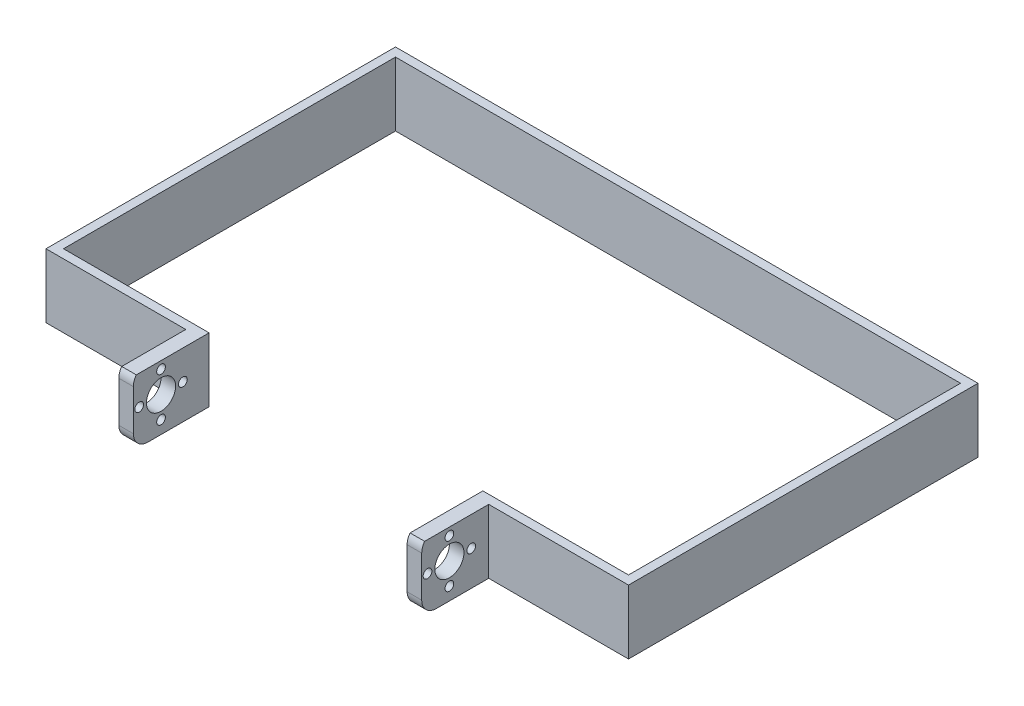
ISO-10303-21;
HEADER;
FILE_DESCRIPTION(('STEP AP214'),'2;1');
FILE_NAME('part.step','',(''),(''),'','','');
FILE_SCHEMA(('AUTOMOTIVE_DESIGN { 1 0 10303 214 1 1 1 1 }'));
ENDSEC;
DATA;
#1=APPLICATION_CONTEXT('core data for automotive mechanical design processes');
#2=APPLICATION_PROTOCOL_DEFINITION('international standard','automotive_design',2000,#1);
#3=PRODUCT_CONTEXT('',#1,'mechanical');
#4=PRODUCT('Part','Part','',(#3));
#5=PRODUCT_RELATED_PRODUCT_CATEGORY('part','',(#4));
#6=PRODUCT_DEFINITION_FORMATION('','',#4);
#7=PRODUCT_DEFINITION_CONTEXT('part definition',#1,'design');
#8=PRODUCT_DEFINITION('design','',#6,#7);
#9=PRODUCT_DEFINITION_SHAPE('','',#8);
#10=(LENGTH_UNIT() NAMED_UNIT(*) SI_UNIT(.MILLI.,.METRE.));
#11=(NAMED_UNIT(*) PLANE_ANGLE_UNIT() SI_UNIT($,.RADIAN.));
#12=(NAMED_UNIT(*) SI_UNIT($,.STERADIAN.) SOLID_ANGLE_UNIT());
#13=UNCERTAINTY_MEASURE_WITH_UNIT(LENGTH_MEASURE(1.E-05),#10,'distance_accuracy_value','');
#14=(GEOMETRIC_REPRESENTATION_CONTEXT(3) GLOBAL_UNCERTAINTY_ASSIGNED_CONTEXT((#13)) GLOBAL_UNIT_ASSIGNED_CONTEXT((#10,
#11,#12)) REPRESENTATION_CONTEXT('',''));
#15=CARTESIAN_POINT('',(0.,0.,0.));
#16=DIRECTION('',(0.,0.,1.));
#17=DIRECTION('',(1.,0.,0.));
#18=AXIS2_PLACEMENT_3D('',#15,#16,#17);
#19=CARTESIAN_POINT('',(67.,-10.8435712373607,3.));
#20=DIRECTION('',(-1.,0.,0.));
#21=DIRECTION('',(0.,0.,1.));
#22=AXIS2_PLACEMENT_3D('',#19,#20,#21);
#23=PLANE('',#22);
#24=CARTESIAN_POINT('',(67.,9.06906844399141,21.));
#25=DIRECTION('',(-1.,0.,0.));
#26=DIRECTION('',(0.,0.,1.));
#27=AXIS2_PLACEMENT_3D('',#24,#25,#26);
#28=CIRCLE('',#27,1.5);
#29=CARTESIAN_POINT('',(67.,9.06906844399141,22.5));
#30=VERTEX_POINT('',#29);
#31=EDGE_CURVE('E388',#30,#30,#28,.T.);
#32=ORIENTED_EDGE('',*,*,#31,.T.);
#33=EDGE_LOOP('',(#32));
#34=FACE_BOUND('',#33,.T.);
#35=CARTESIAN_POINT('',(67.,9.06906844399141,6.));
#36=DIRECTION('',(-1.,0.,0.));
#37=DIRECTION('',(0.,0.,1.));
#38=AXIS2_PLACEMENT_3D('',#35,#36,#37);
#39=CIRCLE('',#38,1.5);
#40=CARTESIAN_POINT('',(67.,9.06906844399141,7.5));
#41=VERTEX_POINT('',#40);
#42=EDGE_CURVE('E379',#41,#41,#39,.T.);
#43=ORIENTED_EDGE('',*,*,#42,.T.);
#44=EDGE_LOOP('',(#43));
#45=FACE_BOUND('',#44,.T.);
#46=CARTESIAN_POINT('',(67.,16.5690684439914,13.5));
#47=DIRECTION('',(-1.,0.,0.));
#48=DIRECTION('',(0.,0.,1.));
#49=AXIS2_PLACEMENT_3D('',#46,#47,#48);
#50=CIRCLE('',#49,1.5);
#51=CARTESIAN_POINT('',(67.,16.5690684439914,15.));
#52=VERTEX_POINT('',#51);
#53=EDGE_CURVE('E370',#52,#52,#50,.T.);
#54=ORIENTED_EDGE('',*,*,#53,.T.);
#55=EDGE_LOOP('',(#54));
#56=FACE_BOUND('',#55,.T.);
#57=CARTESIAN_POINT('',(67.,1.56906844399142,13.5));
#58=DIRECTION('',(-1.,0.,0.));
#59=DIRECTION('',(0.,0.,1.));
#60=AXIS2_PLACEMENT_3D('',#57,#58,#59);
#61=CIRCLE('',#60,1.5);
#62=CARTESIAN_POINT('',(67.,1.56906844399142,15.));
#63=VERTEX_POINT('',#62);
#64=EDGE_CURVE('E361',#63,#63,#61,.T.);
#65=ORIENTED_EDGE('',*,*,#64,.T.);
#66=EDGE_LOOP('',(#65));
#67=FACE_BOUND('',#66,.T.);
#68=CARTESIAN_POINT('',(67.,9.06906844399141,13.5));
#69=DIRECTION('',(-1.,0.,0.));
#70=DIRECTION('',(0.,0.,1.));
#71=AXIS2_PLACEMENT_3D('',#68,#69,#70);
#72=CIRCLE('',#71,5.);
#73=CARTESIAN_POINT('',(67.,9.06906844399141,18.5));
#74=VERTEX_POINT('',#73);
#75=EDGE_CURVE('E352',#74,#74,#72,.T.);
#76=ORIENTED_EDGE('',*,*,#75,.T.);
#77=EDGE_LOOP('',(#76));
#78=FACE_BOUND('',#77,.T.);
#79=DIRECTION('',(0.,1.,0.));
#80=VECTOR('',#79,1.);
#81=CARTESIAN_POINT('',(67.,-10.8435712373607,0.));
#82=LINE('',#81,#80);
#83=CARTESIAN_POINT('',(67.,-2.8435712373607,0.));
#84=VERTEX_POINT('',#83);
#85=CARTESIAN_POINT('',(67.,19.1564287626393,0.));
#86=VERTEX_POINT('',#85);
#87=EDGE_CURVE('E406',#84,#86,#82,.T.);
#88=ORIENTED_EDGE('',*,*,#87,.T.);
#89=DIRECTION('',(0.,0.,1.));
#90=VECTOR('',#89,1.);
#91=CARTESIAN_POINT('',(67.,19.1564287626393,3.));
#92=LINE('',#91,#90);
#93=CARTESIAN_POINT('',(67.,19.1564287626393,22.));
#94=VERTEX_POINT('',#93);
#95=EDGE_CURVE('E265',#86,#94,#92,.T.);
#96=ORIENTED_EDGE('',*,*,#95,.T.);
#97=CARTESIAN_POINT('',(67.,16.1564287626393,18.));
#98=DIRECTION('',(-1.,0.,0.));
#99=DIRECTION('',(0.,0.,1.));
#100=AXIS2_PLACEMENT_3D('',#97,#98,#99);
#101=CIRCLE('',#100,5.);
#102=CARTESIAN_POINT('',(67.,16.1564287626393,23.));
#103=VERTEX_POINT('',#102);
#104=EDGE_CURVE('E446',#94,#103,#101,.F.);
#105=ORIENTED_EDGE('',*,*,#104,.T.);
#106=DIRECTION('',(0.,1.,0.));
#107=VECTOR('',#106,1.);
#108=CARTESIAN_POINT('',(67.,0.,23.));
#109=LINE('',#108,#107);
#110=CARTESIAN_POINT('',(67.,2.1564287626393,23.));
#111=VERTEX_POINT('',#110);
#112=EDGE_CURVE('E396',#111,#103,#109,.T.);
#113=ORIENTED_EDGE('',*,*,#112,.F.);
#114=CARTESIAN_POINT('',(67.,2.1564287626393,18.));
#115=DIRECTION('',(-1.,0.,0.));
#116=DIRECTION('',(0.,0.,1.));
#117=AXIS2_PLACEMENT_3D('',#114,#115,#116);
#118=CIRCLE('',#117,5.);
#119=CARTESIAN_POINT('',(67.,-2.8435712373607,18.));
#120=VERTEX_POINT('',#119);
#121=EDGE_CURVE('E449',#111,#120,#118,.F.);
#122=ORIENTED_EDGE('',*,*,#121,.T.);
#123=DIRECTION('',(0.,0.,-1.));
#124=VECTOR('',#123,1.);
#125=CARTESIAN_POINT('',(67.,-2.8435712373607,3.));
#126=LINE('',#125,#124);
#127=EDGE_CURVE('E301',#120,#84,#126,.T.);
#128=ORIENTED_EDGE('',*,*,#127,.T.);
#129=EDGE_LOOP('',(#88,#96,#105,#113,#122,#128));
#130=FACE_BOUND('',#129,.T.);
#131=ADVANCED_FACE('F41',(#34,#45,#56,#67,#78,#130),#23,.F.);
#132=CARTESIAN_POINT('',(-37.,29.1564287626393,3.));
#133=DIRECTION('',(1.,0.,0.));
#134=DIRECTION('',(0.,0.,-1.));
#135=AXIS2_PLACEMENT_3D('',#132,#133,#134);
#136=PLANE('',#135);
#137=CARTESIAN_POINT('',(-37.,9.06906844399141,21.));
#138=DIRECTION('',(1.,0.,0.));
#139=DIRECTION('',(0.,0.,-1.));
#140=AXIS2_PLACEMENT_3D('',#137,#138,#139);
#141=CIRCLE('',#140,1.5);
#142=CARTESIAN_POINT('',(-37.,9.06906844399141,19.5));
#143=VERTEX_POINT('',#142);
#144=EDGE_CURVE('E336',#143,#143,#141,.T.);
#145=ORIENTED_EDGE('',*,*,#144,.T.);
#146=EDGE_LOOP('',(#145));
#147=FACE_BOUND('',#146,.T.);
#148=CARTESIAN_POINT('',(-37.,9.06906844399141,6.));
#149=DIRECTION('',(1.,0.,0.));
#150=DIRECTION('',(0.,0.,-1.));
#151=AXIS2_PLACEMENT_3D('',#148,#149,#150);
#152=CIRCLE('',#151,1.5);
#153=CARTESIAN_POINT('',(-37.,9.06906844399141,4.5));
#154=VERTEX_POINT('',#153);
#155=EDGE_CURVE('E332',#154,#154,#152,.T.);
#156=ORIENTED_EDGE('',*,*,#155,.T.);
#157=EDGE_LOOP('',(#156));
#158=FACE_BOUND('',#157,.T.);
#159=CARTESIAN_POINT('',(-37.,16.5690684439914,13.5));
#160=DIRECTION('',(1.,0.,0.));
#161=DIRECTION('',(0.,0.,-1.));
#162=AXIS2_PLACEMENT_3D('',#159,#160,#161);
#163=CIRCLE('',#162,1.5);
#164=CARTESIAN_POINT('',(-37.,16.5690684439914,12.));
#165=VERTEX_POINT('',#164);
#166=EDGE_CURVE('E328',#165,#165,#163,.T.);
#167=ORIENTED_EDGE('',*,*,#166,.T.);
#168=EDGE_LOOP('',(#167));
#169=FACE_BOUND('',#168,.T.);
#170=CARTESIAN_POINT('',(-37.,1.56906844399142,13.5));
#171=DIRECTION('',(1.,0.,0.));
#172=DIRECTION('',(0.,0.,-1.));
#173=AXIS2_PLACEMENT_3D('',#170,#171,#172);
#174=CIRCLE('',#173,1.5);
#175=CARTESIAN_POINT('',(-37.,1.56906844399142,12.));
#176=VERTEX_POINT('',#175);
#177=EDGE_CURVE('E327',#176,#176,#174,.T.);
#178=ORIENTED_EDGE('',*,*,#177,.T.);
#179=EDGE_LOOP('',(#178));
#180=FACE_BOUND('',#179,.T.);
#181=CARTESIAN_POINT('',(-37.,9.06906844399141,13.5));
#182=DIRECTION('',(1.,0.,0.));
#183=DIRECTION('',(0.,0.,-1.));
#184=AXIS2_PLACEMENT_3D('',#181,#182,#183);
#185=CIRCLE('',#184,5.);
#186=CARTESIAN_POINT('',(-37.,9.06906844399141,8.49999999999999));
#187=VERTEX_POINT('',#186);
#188=EDGE_CURVE('E340',#187,#187,#185,.T.);
#189=ORIENTED_EDGE('',*,*,#188,.T.);
#190=EDGE_LOOP('',(#189));
#191=FACE_BOUND('',#190,.T.);
#192=CARTESIAN_POINT('',(-37.,16.1564287626393,18.));
#193=DIRECTION('',(1.,0.,0.));
#194=DIRECTION('',(0.,0.,-1.));
#195=AXIS2_PLACEMENT_3D('',#192,#193,#194);
#196=CIRCLE('',#195,5.);
#197=CARTESIAN_POINT('',(-37.,16.1564287626393,23.));
#198=VERTEX_POINT('',#197);
#199=CARTESIAN_POINT('',(-37.,19.1564287626393,22.));
#200=VERTEX_POINT('',#199);
#201=EDGE_CURVE('E456',#198,#200,#196,.F.);
#202=ORIENTED_EDGE('',*,*,#201,.T.);
#203=DIRECTION('',(0.,0.,-1.));
#204=VECTOR('',#203,1.);
#205=CARTESIAN_POINT('',(-37.,19.1564287626393,3.));
#206=LINE('',#205,#204);
#207=CARTESIAN_POINT('',(-37.,19.1564287626393,0.));
#208=VERTEX_POINT('',#207);
#209=EDGE_CURVE('E57',#200,#208,#206,.T.);
#210=ORIENTED_EDGE('',*,*,#209,.T.);
#211=DIRECTION('',(0.,-1.,0.));
#212=VECTOR('',#211,1.);
#213=CARTESIAN_POINT('',(-37.,29.1564287626393,0.));
#214=LINE('',#213,#212);
#215=CARTESIAN_POINT('',(-37.,-2.8435712373607,0.));
#216=VERTEX_POINT('',#215);
#217=EDGE_CURVE('E410',#208,#216,#214,.T.);
#218=ORIENTED_EDGE('',*,*,#217,.T.);
#219=DIRECTION('',(0.,0.,1.));
#220=VECTOR('',#219,1.);
#221=CARTESIAN_POINT('',(-37.,-2.8435712373607,3.));
#222=LINE('',#221,#220);
#223=CARTESIAN_POINT('',(-37.,-2.8435712373607,18.));
#224=VERTEX_POINT('',#223);
#225=EDGE_CURVE('E297',#216,#224,#222,.T.);
#226=ORIENTED_EDGE('',*,*,#225,.T.);
#227=CARTESIAN_POINT('',(-37.,2.1564287626393,18.));
#228=DIRECTION('',(1.,0.,0.));
#229=DIRECTION('',(0.,0.,-1.));
#230=AXIS2_PLACEMENT_3D('',#227,#228,#229);
#231=CIRCLE('',#230,5.);
#232=CARTESIAN_POINT('',(-37.,2.1564287626393,23.));
#233=VERTEX_POINT('',#232);
#234=EDGE_CURVE('E460',#224,#233,#231,.F.);
#235=ORIENTED_EDGE('',*,*,#234,.T.);
#236=DIRECTION('',(0.,-1.,0.));
#237=VECTOR('',#236,1.);
#238=CARTESIAN_POINT('',(-37.,0.,23.));
#239=LINE('',#238,#237);
#240=EDGE_CURVE('E403',#198,#233,#239,.T.);
#241=ORIENTED_EDGE('',*,*,#240,.F.);
#242=EDGE_LOOP('',(#202,#210,#218,#226,#235,#241));
#243=FACE_BOUND('',#242,.T.);
#244=ADVANCED_FACE('F489',(#147,#158,#169,#180,#191,#243),#136,.F.);
#245=CARTESIAN_POINT('',(-32.,0.,23.));
#246=DIRECTION('',(1.,0.,0.));
#247=DIRECTION('',(0.,1.,0.));
#248=AXIS2_PLACEMENT_3D('',#245,#246,#247);
#249=PLANE('',#248);
#250=DIRECTION('',(0.,0.,-1.));
#251=VECTOR('',#250,1.);
#252=CARTESIAN_POINT('',(-32.,19.1564287626393,23.));
#253=LINE('',#252,#251);
#254=CARTESIAN_POINT('',(-32.,19.1564287626393,22.));
#255=VERTEX_POINT('',#254);
#256=CARTESIAN_POINT('',(-32.,19.1564287626393,-3.));
#257=VERTEX_POINT('',#256);
#258=EDGE_CURVE('E232',#255,#257,#253,.T.);
#259=ORIENTED_EDGE('',*,*,#258,.F.);
#260=CARTESIAN_POINT('',(-32.,16.1564287626393,18.));
#261=DIRECTION('',(1.,0.,0.));
#262=DIRECTION('',(0.,1.,0.));
#263=AXIS2_PLACEMENT_3D('',#260,#261,#262);
#264=CIRCLE('',#263,5.);
#265=CARTESIAN_POINT('',(-32.,16.1564287626393,23.));
#266=VERTEX_POINT('',#265);
#267=EDGE_CURVE('E469',#255,#266,#264,.T.);
#268=ORIENTED_EDGE('',*,*,#267,.T.);
#269=DIRECTION('',(0.,-1.,0.));
#270=VECTOR('',#269,1.);
#271=CARTESIAN_POINT('',(-32.,0.,23.));
#272=LINE('',#271,#270);
#273=CARTESIAN_POINT('',(-32.,2.1564287626393,23.));
#274=VERTEX_POINT('',#273);
#275=EDGE_CURVE('E400',#266,#274,#272,.T.);
#276=ORIENTED_EDGE('',*,*,#275,.T.);
#277=CARTESIAN_POINT('',(-32.,2.1564287626393,18.));
#278=DIRECTION('',(1.,0.,0.));
#279=DIRECTION('',(0.,1.,0.));
#280=AXIS2_PLACEMENT_3D('',#277,#278,#279);
#281=CIRCLE('',#280,5.);
#282=CARTESIAN_POINT('',(-32.,-2.8435712373607,18.));
#283=VERTEX_POINT('',#282);
#284=EDGE_CURVE('E472',#274,#283,#281,.T.);
#285=ORIENTED_EDGE('',*,*,#284,.T.);
#286=DIRECTION('',(0.,0.,1.));
#287=VECTOR('',#286,1.);
#288=CARTESIAN_POINT('',(-32.,-2.8435712373607,23.));
#289=LINE('',#288,#287);
#290=CARTESIAN_POINT('',(-32.,-2.84357123736069,-3.));
#291=VERTEX_POINT('',#290);
#292=EDGE_CURVE('E293',#291,#283,#289,.T.);
#293=ORIENTED_EDGE('',*,*,#292,.F.);
#294=DIRECTION('',(0.,1.,0.));
#295=VECTOR('',#294,1.);
#296=CARTESIAN_POINT('',(-32.,-70.8435712373607,-3.));
#297=LINE('',#296,#295);
#298=EDGE_CURVE('E306',#291,#257,#297,.T.);
#299=ORIENTED_EDGE('',*,*,#298,.T.);
#300=EDGE_LOOP('',(#259,#268,#276,#285,#293,#299));
#301=FACE_BOUND('',#300,.T.);
#302=CARTESIAN_POINT('',(-32.,9.06906844399141,21.));
#303=DIRECTION('',(1.,0.,0.));
#304=DIRECTION('',(0.,1.,0.));
#305=AXIS2_PLACEMENT_3D('',#302,#303,#304);
#306=CIRCLE('',#305,1.5);
#307=CARTESIAN_POINT('',(-32.,10.5690684439914,21.));
#308=VERTEX_POINT('',#307);
#309=EDGE_CURVE('E384',#308,#308,#306,.T.);
#310=ORIENTED_EDGE('',*,*,#309,.F.);
#311=EDGE_LOOP('',(#310));
#312=FACE_BOUND('',#311,.T.);
#313=CARTESIAN_POINT('',(-32.,9.06906844399141,6.));
#314=DIRECTION('',(1.,0.,0.));
#315=DIRECTION('',(0.,1.,0.));
#316=AXIS2_PLACEMENT_3D('',#313,#314,#315);
#317=CIRCLE('',#316,1.5);
#318=CARTESIAN_POINT('',(-32.,10.5690684439914,6.));
#319=VERTEX_POINT('',#318);
#320=EDGE_CURVE('E375',#319,#319,#317,.T.);
#321=ORIENTED_EDGE('',*,*,#320,.F.);
#322=EDGE_LOOP('',(#321));
#323=FACE_BOUND('',#322,.T.);
#324=CARTESIAN_POINT('',(-32.,16.5690684439914,13.5));
#325=DIRECTION('',(1.,0.,0.));
#326=DIRECTION('',(0.,1.,0.));
#327=AXIS2_PLACEMENT_3D('',#324,#325,#326);
#328=CIRCLE('',#327,1.5);
#329=CARTESIAN_POINT('',(-32.,18.0690684439914,13.5));
#330=VERTEX_POINT('',#329);
#331=EDGE_CURVE('E366',#330,#330,#328,.T.);
#332=ORIENTED_EDGE('',*,*,#331,.F.);
#333=EDGE_LOOP('',(#332));
#334=FACE_BOUND('',#333,.T.);
#335=CARTESIAN_POINT('',(-32.,1.56906844399142,13.5));
#336=DIRECTION('',(1.,0.,0.));
#337=DIRECTION('',(0.,1.,0.));
#338=AXIS2_PLACEMENT_3D('',#335,#336,#337);
#339=CIRCLE('',#338,1.5);
#340=CARTESIAN_POINT('',(-32.,3.06906844399142,13.5));
#341=VERTEX_POINT('',#340);
#342=EDGE_CURVE('E357',#341,#341,#339,.T.);
#343=ORIENTED_EDGE('',*,*,#342,.F.);
#344=EDGE_LOOP('',(#343));
#345=FACE_BOUND('',#344,.T.);
#346=CARTESIAN_POINT('',(-32.,9.06906844399141,13.5));
#347=DIRECTION('',(1.,0.,0.));
#348=DIRECTION('',(0.,1.,0.));
#349=AXIS2_PLACEMENT_3D('',#346,#347,#348);
#350=CIRCLE('',#349,5.);
#351=CARTESIAN_POINT('',(-32.,14.0690684439914,13.5));
#352=VERTEX_POINT('',#351);
#353=EDGE_CURVE('E348',#352,#352,#350,.T.);
#354=ORIENTED_EDGE('',*,*,#353,.F.);
#355=EDGE_LOOP('',(#354));
#356=FACE_BOUND('',#355,.T.);
#357=ADVANCED_FACE('F482',(#301,#312,#323,#334,#345,#356),#249,.T.);
#358=CARTESIAN_POINT('',(0.,0.,23.));
#359=DIRECTION('',(0.,0.,1.));
#360=DIRECTION('',(1.,0.,0.));
#361=AXIS2_PLACEMENT_3D('',#358,#359,#360);
#362=PLANE('',#361);
#363=ORIENTED_EDGE('',*,*,#240,.T.);
#364=DIRECTION('',(-1.,0.,0.));
#365=VECTOR('',#364,1.);
#366=CARTESIAN_POINT('',(-32.,2.1564287626393,23.));
#367=LINE('',#366,#365);
#368=EDGE_CURVE('E65',#233,#274,#367,.F.);
#369=ORIENTED_EDGE('',*,*,#368,.T.);
#370=ORIENTED_EDGE('',*,*,#275,.F.);
#371=DIRECTION('',(-1.,0.,0.));
#372=VECTOR('',#371,1.);
#373=CARTESIAN_POINT('',(-37.,16.1564287626393,23.));
#374=LINE('',#373,#372);
#375=EDGE_CURVE('E463',#266,#198,#374,.T.);
#376=ORIENTED_EDGE('',*,*,#375,.T.);
#377=EDGE_LOOP('',(#363,#369,#370,#376));
#378=FACE_BOUND('',#377,.T.);
#379=ADVANCED_FACE('F487',(#378),#362,.T.);
#380=CARTESIAN_POINT('',(62.,0.,23.));
#381=DIRECTION('',(1.,0.,0.));
#382=DIRECTION('',(0.,1.,0.));
#383=AXIS2_PLACEMENT_3D('',#380,#381,#382);
#384=PLANE('',#383);
#385=CARTESIAN_POINT('',(62.,9.06906844399141,21.));
#386=DIRECTION('',(1.,0.,0.));
#387=DIRECTION('',(0.,1.,0.));
#388=AXIS2_PLACEMENT_3D('',#385,#386,#387);
#389=CIRCLE('',#388,1.5);
#390=CARTESIAN_POINT('',(62.,10.5690684439914,21.));
#391=VERTEX_POINT('',#390);
#392=EDGE_CURVE('E383',#391,#391,#389,.T.);
#393=ORIENTED_EDGE('',*,*,#392,.T.);
#394=EDGE_LOOP('',(#393));
#395=FACE_BOUND('',#394,.T.);
#396=CARTESIAN_POINT('',(62.,9.06906844399141,6.));
#397=DIRECTION('',(1.,0.,0.));
#398=DIRECTION('',(0.,1.,0.));
#399=AXIS2_PLACEMENT_3D('',#396,#397,#398);
#400=CIRCLE('',#399,1.5);
#401=CARTESIAN_POINT('',(62.,10.5690684439914,6.));
#402=VERTEX_POINT('',#401);
#403=EDGE_CURVE('E374',#402,#402,#400,.T.);
#404=ORIENTED_EDGE('',*,*,#403,.T.);
#405=EDGE_LOOP('',(#404));
#406=FACE_BOUND('',#405,.T.);
#407=CARTESIAN_POINT('',(62.,16.5690684439914,13.5));
#408=DIRECTION('',(1.,0.,0.));
#409=DIRECTION('',(0.,1.,0.));
#410=AXIS2_PLACEMENT_3D('',#407,#408,#409);
#411=CIRCLE('',#410,1.5);
#412=CARTESIAN_POINT('',(62.,18.0690684439914,13.5));
#413=VERTEX_POINT('',#412);
#414=EDGE_CURVE('E365',#413,#413,#411,.T.);
#415=ORIENTED_EDGE('',*,*,#414,.T.);
#416=EDGE_LOOP('',(#415));
#417=FACE_BOUND('',#416,.T.);
#418=CARTESIAN_POINT('',(62.,1.56906844399142,13.5));
#419=DIRECTION('',(1.,0.,0.));
#420=DIRECTION('',(0.,1.,0.));
#421=AXIS2_PLACEMENT_3D('',#418,#419,#420);
#422=CIRCLE('',#421,1.5);
#423=CARTESIAN_POINT('',(62.,3.06906844399142,13.5));
#424=VERTEX_POINT('',#423);
#425=EDGE_CURVE('E356',#424,#424,#422,.T.);
#426=ORIENTED_EDGE('',*,*,#425,.T.);
#427=EDGE_LOOP('',(#426));
#428=FACE_BOUND('',#427,.T.);
#429=CARTESIAN_POINT('',(62.,9.06906844399141,13.5));
#430=DIRECTION('',(1.,0.,0.));
#431=DIRECTION('',(0.,1.,0.));
#432=AXIS2_PLACEMENT_3D('',#429,#430,#431);
#433=CIRCLE('',#432,5.);
#434=CARTESIAN_POINT('',(62.,14.0690684439914,13.5));
#435=VERTEX_POINT('',#434);
#436=EDGE_CURVE('E347',#435,#435,#433,.T.);
#437=ORIENTED_EDGE('',*,*,#436,.T.);
#438=EDGE_LOOP('',(#437));
#439=FACE_BOUND('',#438,.T.);
#440=CARTESIAN_POINT('',(62.,16.1564287626393,18.));
#441=DIRECTION('',(1.,0.,0.));
#442=DIRECTION('',(0.,1.,0.));
#443=AXIS2_PLACEMENT_3D('',#440,#441,#442);
#444=CIRCLE('',#443,5.);
#445=CARTESIAN_POINT('',(62.,16.1564287626393,23.));
#446=VERTEX_POINT('',#445);
#447=CARTESIAN_POINT('',(62.,19.1564287626393,22.));
#448=VERTEX_POINT('',#447);
#449=EDGE_CURVE('E432',#446,#448,#444,.F.);
#450=ORIENTED_EDGE('',*,*,#449,.T.);
#451=DIRECTION('',(0.,0.,-1.));
#452=VECTOR('',#451,1.);
#453=CARTESIAN_POINT('',(62.,19.1564287626393,23.));
#454=LINE('',#453,#452);
#455=CARTESIAN_POINT('',(62.,19.1564287626393,-3.00000000000001));
#456=VERTEX_POINT('',#455);
#457=EDGE_CURVE('E258',#448,#456,#454,.T.);
#458=ORIENTED_EDGE('',*,*,#457,.T.);
#459=DIRECTION('',(0.,1.,0.));
#460=VECTOR('',#459,1.);
#461=CARTESIAN_POINT('',(62.,-70.8435712373607,-3.00000000000001));
#462=LINE('',#461,#460);
#463=CARTESIAN_POINT('',(62.,-2.84357123736069,-3.00000000000001));
#464=VERTEX_POINT('',#463);
#465=EDGE_CURVE('E305',#464,#456,#462,.T.);
#466=ORIENTED_EDGE('',*,*,#465,.F.);
#467=DIRECTION('',(0.,0.,1.));
#468=VECTOR('',#467,1.);
#469=CARTESIAN_POINT('',(62.,-2.8435712373607,23.));
#470=LINE('',#469,#468);
#471=CARTESIAN_POINT('',(62.,-2.8435712373607,18.));
#472=VERTEX_POINT('',#471);
#473=EDGE_CURVE('E289',#464,#472,#470,.T.);
#474=ORIENTED_EDGE('',*,*,#473,.T.);
#475=CARTESIAN_POINT('',(62.,2.1564287626393,18.));
#476=DIRECTION('',(1.,0.,0.));
#477=DIRECTION('',(0.,1.,0.));
#478=AXIS2_PLACEMENT_3D('',#475,#476,#477);
#479=CIRCLE('',#478,5.);
#480=CARTESIAN_POINT('',(62.,2.1564287626393,23.));
#481=VERTEX_POINT('',#480);
#482=EDGE_CURVE('E436',#472,#481,#479,.F.);
#483=ORIENTED_EDGE('',*,*,#482,.T.);
#484=DIRECTION('',(0.,-1.,0.));
#485=VECTOR('',#484,1.);
#486=CARTESIAN_POINT('',(62.,0.,23.));
#487=LINE('',#486,#485);
#488=EDGE_CURVE('E392',#446,#481,#487,.T.);
#489=ORIENTED_EDGE('',*,*,#488,.F.);
#490=EDGE_LOOP('',(#450,#458,#466,#474,#483,#489));
#491=FACE_BOUND('',#490,.T.);
#492=ADVANCED_FACE('F594',(#395,#406,#417,#428,#439,#491),#384,.F.);
#493=CARTESIAN_POINT('',(0.,0.,23.));
#494=DIRECTION('',(0.,0.,1.));
#495=DIRECTION('',(1.,0.,0.));
#496=AXIS2_PLACEMENT_3D('',#493,#494,#495);
#497=PLANE('',#496);
#498=ORIENTED_EDGE('',*,*,#488,.T.);
#499=DIRECTION('',(-1.,0.,0.));
#500=VECTOR('',#499,1.);
#501=CARTESIAN_POINT('',(67.,2.1564287626393,23.));
#502=LINE('',#501,#500);
#503=EDGE_CURVE('E443',#481,#111,#502,.F.);
#504=ORIENTED_EDGE('',*,*,#503,.T.);
#505=ORIENTED_EDGE('',*,*,#112,.T.);
#506=DIRECTION('',(-1.,0.,0.));
#507=VECTOR('',#506,1.);
#508=CARTESIAN_POINT('',(62.,16.1564287626393,23.));
#509=LINE('',#508,#507);
#510=EDGE_CURVE('E439',#103,#446,#509,.T.);
#511=ORIENTED_EDGE('',*,*,#510,.T.);
#512=EDGE_LOOP('',(#498,#504,#505,#511));
#513=FACE_BOUND('',#512,.T.);
#514=ADVANCED_FACE('F591',(#513),#497,.T.);
#515=CARTESIAN_POINT('',(-37.,9.06906844399141,13.5));
#516=DIRECTION('',(1.,0.,0.));
#517=DIRECTION('',(0.,0.,-1.));
#518=AXIS2_PLACEMENT_3D('',#515,#516,#517);
#519=CYLINDRICAL_SURFACE('',#518,5.);
#520=ORIENTED_EDGE('',*,*,#436,.F.);
#521=EDGE_LOOP('',(#520));
#522=FACE_BOUND('',#521,.T.);
#523=ORIENTED_EDGE('',*,*,#75,.F.);
#524=EDGE_LOOP('',(#523));
#525=FACE_BOUND('',#524,.T.);
#526=ADVANCED_FACE('F590',(#522,#525),#519,.F.);
#527=CARTESIAN_POINT('',(-37.,1.56906844399142,13.5));
#528=DIRECTION('',(1.,0.,0.));
#529=DIRECTION('',(0.,0.,-1.));
#530=AXIS2_PLACEMENT_3D('',#527,#528,#529);
#531=CYLINDRICAL_SURFACE('',#530,1.5);
#532=ORIENTED_EDGE('',*,*,#425,.F.);
#533=EDGE_LOOP('',(#532));
#534=FACE_BOUND('',#533,.T.);
#535=ORIENTED_EDGE('',*,*,#64,.F.);
#536=EDGE_LOOP('',(#535));
#537=FACE_BOUND('',#536,.T.);
#538=ADVANCED_FACE('F578',(#534,#537),#531,.F.);
#539=CARTESIAN_POINT('',(-37.,16.5690684439914,13.5));
#540=DIRECTION('',(1.,0.,0.));
#541=DIRECTION('',(0.,0.,-1.));
#542=AXIS2_PLACEMENT_3D('',#539,#540,#541);
#543=CYLINDRICAL_SURFACE('',#542,1.5);
#544=ORIENTED_EDGE('',*,*,#414,.F.);
#545=EDGE_LOOP('',(#544));
#546=FACE_BOUND('',#545,.T.);
#547=ORIENTED_EDGE('',*,*,#53,.F.);
#548=EDGE_LOOP('',(#547));
#549=FACE_BOUND('',#548,.T.);
#550=ADVANCED_FACE('F573',(#546,#549),#543,.F.);
#551=CARTESIAN_POINT('',(-37.,9.06906844399141,6.));
#552=DIRECTION('',(1.,0.,0.));
#553=DIRECTION('',(0.,0.,-1.));
#554=AXIS2_PLACEMENT_3D('',#551,#552,#553);
#555=CYLINDRICAL_SURFACE('',#554,1.5);
#556=ORIENTED_EDGE('',*,*,#403,.F.);
#557=EDGE_LOOP('',(#556));
#558=FACE_BOUND('',#557,.T.);
#559=ORIENTED_EDGE('',*,*,#42,.F.);
#560=EDGE_LOOP('',(#559));
#561=FACE_BOUND('',#560,.T.);
#562=ADVANCED_FACE('F586',(#558,#561),#555,.F.);
#563=CARTESIAN_POINT('',(-37.,9.06906844399141,21.));
#564=DIRECTION('',(1.,0.,0.));
#565=DIRECTION('',(0.,0.,-1.));
#566=AXIS2_PLACEMENT_3D('',#563,#564,#565);
#567=CYLINDRICAL_SURFACE('',#566,1.5);
#568=ORIENTED_EDGE('',*,*,#392,.F.);
#569=EDGE_LOOP('',(#568));
#570=FACE_BOUND('',#569,.T.);
#571=ORIENTED_EDGE('',*,*,#31,.F.);
#572=EDGE_LOOP('',(#571));
#573=FACE_BOUND('',#572,.T.);
#574=ADVANCED_FACE('F582',(#570,#573),#567,.F.);
#575=ORIENTED_EDGE('',*,*,#353,.T.);
#576=EDGE_LOOP('',(#575));
#577=FACE_BOUND('',#576,.T.);
#578=ORIENTED_EDGE('',*,*,#188,.F.);
#579=EDGE_LOOP('',(#578));
#580=FACE_BOUND('',#579,.T.);
#581=ADVANCED_FACE('F576',(#577,#580),#519,.F.);
#582=ORIENTED_EDGE('',*,*,#342,.T.);
#583=EDGE_LOOP('',(#582));
#584=FACE_BOUND('',#583,.T.);
#585=ORIENTED_EDGE('',*,*,#177,.F.);
#586=EDGE_LOOP('',(#585));
#587=FACE_BOUND('',#586,.T.);
#588=ADVANCED_FACE('F571',(#584,#587),#531,.F.);
#589=ORIENTED_EDGE('',*,*,#331,.T.);
#590=EDGE_LOOP('',(#589));
#591=FACE_BOUND('',#590,.T.);
#592=ORIENTED_EDGE('',*,*,#166,.F.);
#593=EDGE_LOOP('',(#592));
#594=FACE_BOUND('',#593,.T.);
#595=ADVANCED_FACE('F567',(#591,#594),#543,.F.);
#596=ORIENTED_EDGE('',*,*,#320,.T.);
#597=EDGE_LOOP('',(#596));
#598=FACE_BOUND('',#597,.T.);
#599=ORIENTED_EDGE('',*,*,#155,.F.);
#600=EDGE_LOOP('',(#599));
#601=FACE_BOUND('',#600,.T.);
#602=ADVANCED_FACE('F570',(#598,#601),#555,.F.);
#603=ORIENTED_EDGE('',*,*,#309,.T.);
#604=EDGE_LOOP('',(#603));
#605=FACE_BOUND('',#604,.T.);
#606=ORIENTED_EDGE('',*,*,#144,.F.);
#607=EDGE_LOOP('',(#606));
#608=FACE_BOUND('',#607,.T.);
#609=ADVANCED_FACE('F560',(#605,#608),#567,.F.);
#610=CARTESIAN_POINT('',(0.,0.,0.));
#611=DIRECTION('',(0.,0.,-1.));
#612=DIRECTION('',(-1.,0.,0.));
#613=AXIS2_PLACEMENT_3D('',#610,#611,#612);
#614=PLANE('',#613);
#615=ORIENTED_EDGE('',*,*,#217,.F.);
#616=DIRECTION('',(-1.,0.,0.));
#617=VECTOR('',#616,1.);
#618=CARTESIAN_POINT('',(0.,19.1564287626393,0.));
#619=LINE('',#618,#617);
#620=CARTESIAN_POINT('',(-85.,19.1564287626393,0.));
#621=VERTEX_POINT('',#620);
#622=EDGE_CURVE('E241',#208,#621,#619,.T.);
#623=ORIENTED_EDGE('',*,*,#622,.T.);
#624=DIRECTION('',(0.,1.,0.));
#625=VECTOR('',#624,1.);
#626=CARTESIAN_POINT('',(-85.,29.1564287626393,0.));
#627=LINE('',#626,#625);
#628=CARTESIAN_POINT('',(-85.,-2.8435712373607,0.));
#629=VERTEX_POINT('',#628);
#630=EDGE_CURVE('E323',#629,#621,#627,.T.);
#631=ORIENTED_EDGE('',*,*,#630,.F.);
#632=DIRECTION('',(-1.,0.,0.));
#633=VECTOR('',#632,1.);
#634=CARTESIAN_POINT('',(115.,-2.8435712373607,0.));
#635=LINE('',#634,#633);
#636=EDGE_CURVE('E276',#216,#629,#635,.T.);
#637=ORIENTED_EDGE('',*,*,#636,.F.);
#638=EDGE_LOOP('',(#615,#623,#631,#637));
#639=FACE_BOUND('',#638,.T.);
#640=ADVANCED_FACE('F556',(#639),#614,.F.);
#641=CARTESIAN_POINT('',(-85.,29.1564287626393,-100.));
#642=DIRECTION('',(1.,0.,0.));
#643=DIRECTION('',(0.,0.,-1.));
#644=AXIS2_PLACEMENT_3D('',#641,#642,#643);
#645=PLANE('',#644);
#646=ORIENTED_EDGE('',*,*,#630,.T.);
#647=DIRECTION('',(0.,0.,-1.));
#648=VECTOR('',#647,1.);
#649=CARTESIAN_POINT('',(-85.,19.1564287626393,-100.));
#650=LINE('',#649,#648);
#651=CARTESIAN_POINT('',(-85.,19.1564287626393,-120.));
#652=VERTEX_POINT('',#651);
#653=EDGE_CURVE('E249',#621,#652,#650,.T.);
#654=ORIENTED_EDGE('',*,*,#653,.T.);
#655=DIRECTION('',(0.,-1.,0.));
#656=VECTOR('',#655,1.);
#657=CARTESIAN_POINT('',(-85.,19.1564287626393,-120.));
#658=LINE('',#657,#656);
#659=CARTESIAN_POINT('',(-85.,-2.8435712373607,-120.));
#660=VERTEX_POINT('',#659);
#661=EDGE_CURVE('E211',#652,#660,#658,.T.);
#662=ORIENTED_EDGE('',*,*,#661,.T.);
#663=DIRECTION('',(0.,0.,1.));
#664=VECTOR('',#663,1.);
#665=CARTESIAN_POINT('',(-85.,-2.8435712373607,-100.));
#666=LINE('',#665,#664);
#667=EDGE_CURVE('E285',#660,#629,#666,.T.);
#668=ORIENTED_EDGE('',*,*,#667,.T.);
#669=EDGE_LOOP('',(#646,#654,#662,#668));
#670=FACE_BOUND('',#669,.T.);
#671=ADVANCED_FACE('F559',(#670),#645,.F.);
#672=CARTESIAN_POINT('',(115.,29.1564287626393,-100.));
#673=DIRECTION('',(-1.,0.,0.));
#674=DIRECTION('',(0.,0.,1.));
#675=AXIS2_PLACEMENT_3D('',#672,#673,#674);
#676=PLANE('',#675);
#677=DIRECTION('',(0.,0.,-1.));
#678=VECTOR('',#677,1.);
#679=CARTESIAN_POINT('',(115.,-2.8435712373607,-100.));
#680=LINE('',#679,#678);
#681=CARTESIAN_POINT('',(115.,-2.8435712373607,0.));
#682=VERTEX_POINT('',#681);
#683=CARTESIAN_POINT('',(115.,-2.8435712373607,-120.));
#684=VERTEX_POINT('',#683);
#685=EDGE_CURVE('E273',#682,#684,#680,.T.);
#686=ORIENTED_EDGE('',*,*,#685,.T.);
#687=DIRECTION('',(0.,1.,0.));
#688=VECTOR('',#687,1.);
#689=CARTESIAN_POINT('',(115.,19.1564287626393,-120.));
#690=LINE('',#689,#688);
#691=CARTESIAN_POINT('',(115.,19.1564287626393,-120.));
#692=VERTEX_POINT('',#691);
#693=EDGE_CURVE('E213',#684,#692,#690,.T.);
#694=ORIENTED_EDGE('',*,*,#693,.T.);
#695=DIRECTION('',(0.,0.,1.));
#696=VECTOR('',#695,1.);
#697=CARTESIAN_POINT('',(115.,19.1564287626393,-105.317819495557));
#698=LINE('',#697,#696);
#699=CARTESIAN_POINT('',(115.,19.1564287626393,0.));
#700=VERTEX_POINT('',#699);
#701=EDGE_CURVE('E217',#692,#700,#698,.T.);
#702=ORIENTED_EDGE('',*,*,#701,.T.);
#703=DIRECTION('',(0.,-1.,0.));
#704=VECTOR('',#703,1.);
#705=CARTESIAN_POINT('',(115.,29.1564287626393,0.));
#706=LINE('',#705,#704);
#707=EDGE_CURVE('E310',#700,#682,#706,.T.);
#708=ORIENTED_EDGE('',*,*,#707,.T.);
#709=EDGE_LOOP('',(#686,#694,#702,#708));
#710=FACE_BOUND('',#709,.T.);
#711=ADVANCED_FACE('F563',(#710),#676,.F.);
#712=ORIENTED_EDGE('',*,*,#707,.F.);
#713=DIRECTION('',(-1.,0.,0.));
#714=VECTOR('',#713,1.);
#715=CARTESIAN_POINT('',(0.,19.1564287626393,0.));
#716=LINE('',#715,#714);
#717=EDGE_CURVE('E269',#700,#86,#716,.T.);
#718=ORIENTED_EDGE('',*,*,#717,.T.);
#719=ORIENTED_EDGE('',*,*,#87,.F.);
#720=EDGE_CURVE('E193',#682,#84,#635,.T.);
#721=ORIENTED_EDGE('',*,*,#720,.F.);
#722=EDGE_LOOP('',(#712,#718,#719,#721));
#723=FACE_BOUND('',#722,.T.);
#724=ADVANCED_FACE('F510',(#723),#614,.F.);
#725=CARTESIAN_POINT('',(-32.,-70.8435712373607,-3.));
#726=DIRECTION('',(0.,0.,1.));
#727=DIRECTION('',(1.,0.,0.));
#728=AXIS2_PLACEMENT_3D('',#725,#726,#727);
#729=PLANE('',#728);
#730=DIRECTION('',(0.,1.,0.));
#731=VECTOR('',#730,1.);
#732=CARTESIAN_POINT('',(-82.,-70.8435712373607,-3.00000000000002));
#733=LINE('',#732,#731);
#734=CARTESIAN_POINT('',(-82.,-2.84357123736069,-3.00000000000002));
#735=VERTEX_POINT('',#734);
#736=CARTESIAN_POINT('',(-82.,19.1564287626393,-3.00000000000002));
#737=VERTEX_POINT('',#736);
#738=EDGE_CURVE('E311',#735,#737,#733,.T.);
#739=ORIENTED_EDGE('',*,*,#738,.T.);
#740=DIRECTION('',(1.,0.,0.));
#741=VECTOR('',#740,1.);
#742=CARTESIAN_POINT('',(-32.,19.1564287626393,-3.));
#743=LINE('',#742,#741);
#744=EDGE_CURVE('E237',#737,#257,#743,.T.);
#745=ORIENTED_EDGE('',*,*,#744,.T.);
#746=ORIENTED_EDGE('',*,*,#298,.F.);
#747=DIRECTION('',(-1.,0.,0.));
#748=VECTOR('',#747,1.);
#749=CARTESIAN_POINT('',(-32.,-2.84357123736069,-3.));
#750=LINE('',#749,#748);
#751=EDGE_CURVE('E281',#291,#735,#750,.T.);
#752=ORIENTED_EDGE('',*,*,#751,.T.);
#753=EDGE_LOOP('',(#739,#745,#746,#752));
#754=FACE_BOUND('',#753,.T.);
#755=ADVANCED_FACE('F498',(#754),#729,.F.);
#756=CARTESIAN_POINT('',(-82.,-70.8435712373607,-97.));
#757=DIRECTION('',(-1.,0.,0.));
#758=DIRECTION('',(0.,0.,1.));
#759=AXIS2_PLACEMENT_3D('',#756,#757,#758);
#760=PLANE('',#759);
#761=DIRECTION('',(0.,0.,-1.));
#762=VECTOR('',#761,1.);
#763=CARTESIAN_POINT('',(-82.,-2.84357123736069,-97.));
#764=LINE('',#763,#762);
#765=CARTESIAN_POINT('',(-82.,-2.8435712373607,-117.));
#766=VERTEX_POINT('',#765);
#767=EDGE_CURVE('E192',#735,#766,#764,.T.);
#768=ORIENTED_EDGE('',*,*,#767,.T.);
#769=DIRECTION('',(0.,1.,0.));
#770=VECTOR('',#769,1.);
#771=CARTESIAN_POINT('',(-82.,-2.8435712373607,-117.));
#772=LINE('',#771,#770);
#773=CARTESIAN_POINT('',(-82.,19.1564287626393,-117.));
#774=VERTEX_POINT('',#773);
#775=EDGE_CURVE('E202',#766,#774,#772,.T.);
#776=ORIENTED_EDGE('',*,*,#775,.T.);
#777=DIRECTION('',(0.,0.,1.));
#778=VECTOR('',#777,1.);
#779=CARTESIAN_POINT('',(-82.,19.1564287626393,-97.));
#780=LINE('',#779,#778);
#781=EDGE_CURVE('E245',#774,#737,#780,.T.);
#782=ORIENTED_EDGE('',*,*,#781,.T.);
#783=ORIENTED_EDGE('',*,*,#738,.F.);
#784=EDGE_LOOP('',(#768,#776,#782,#783));
#785=FACE_BOUND('',#784,.T.);
#786=ADVANCED_FACE('F500',(#785),#760,.F.);
#787=CARTESIAN_POINT('',(112.,-70.8435712373607,-97.));
#788=DIRECTION('',(1.,0.,0.));
#789=DIRECTION('',(0.,0.,-1.));
#790=AXIS2_PLACEMENT_3D('',#787,#788,#789);
#791=PLANE('',#790);
#792=DIRECTION('',(0.,1.,0.));
#793=VECTOR('',#792,1.);
#794=CARTESIAN_POINT('',(112.,-70.8435712373607,-3.00000000000002));
#795=LINE('',#794,#793);
#796=CARTESIAN_POINT('',(112.,-2.84357123736069,-3.00000000000002));
#797=VERTEX_POINT('',#796);
#798=CARTESIAN_POINT('',(112.,19.1564287626393,-3.00000000000002));
#799=VERTEX_POINT('',#798);
#800=EDGE_CURVE('E315',#797,#799,#795,.T.);
#801=ORIENTED_EDGE('',*,*,#800,.T.);
#802=DIRECTION('',(0.,0.,-1.));
#803=VECTOR('',#802,1.);
#804=CARTESIAN_POINT('',(112.,19.1564287626393,-97.));
#805=LINE('',#804,#803);
#806=CARTESIAN_POINT('',(112.,19.1564287626393,-117.));
#807=VERTEX_POINT('',#806);
#808=EDGE_CURVE('E198',#799,#807,#805,.T.);
#809=ORIENTED_EDGE('',*,*,#808,.T.);
#810=DIRECTION('',(0.,1.,0.));
#811=VECTOR('',#810,1.);
#812=CARTESIAN_POINT('',(112.,-2.8435712373607,-117.));
#813=LINE('',#812,#811);
#814=CARTESIAN_POINT('',(112.,-2.8435712373607,-117.));
#815=VERTEX_POINT('',#814);
#816=EDGE_CURVE('E196',#815,#807,#813,.T.);
#817=ORIENTED_EDGE('',*,*,#816,.F.);
#818=DIRECTION('',(0.,0.,1.));
#819=VECTOR('',#818,1.);
#820=CARTESIAN_POINT('',(112.,-2.84357123736069,-97.));
#821=LINE('',#820,#819);
#822=EDGE_CURVE('E181',#815,#797,#821,.T.);
#823=ORIENTED_EDGE('',*,*,#822,.T.);
#824=EDGE_LOOP('',(#801,#809,#817,#823));
#825=FACE_BOUND('',#824,.T.);
#826=ADVANCED_FACE('F197',(#825),#791,.F.);
#827=CARTESIAN_POINT('',(112.,-70.8435712373607,-3.00000000000002));
#828=DIRECTION('',(0.,0.,1.));
#829=DIRECTION('',(1.,0.,0.));
#830=AXIS2_PLACEMENT_3D('',#827,#828,#829);
#831=PLANE('',#830);
#832=ORIENTED_EDGE('',*,*,#465,.T.);
#833=DIRECTION('',(1.,0.,0.));
#834=VECTOR('',#833,1.);
#835=CARTESIAN_POINT('',(112.,19.1564287626393,-3.00000000000002));
#836=LINE('',#835,#834);
#837=EDGE_CURVE('E254',#456,#799,#836,.T.);
#838=ORIENTED_EDGE('',*,*,#837,.T.);
#839=ORIENTED_EDGE('',*,*,#800,.F.);
#840=DIRECTION('',(-1.,0.,0.));
#841=VECTOR('',#840,1.);
#842=CARTESIAN_POINT('',(112.,-2.84357123736069,-3.00000000000002));
#843=LINE('',#842,#841);
#844=EDGE_CURVE('E187',#797,#464,#843,.T.);
#845=ORIENTED_EDGE('',*,*,#844,.T.);
#846=EDGE_LOOP('',(#832,#838,#839,#845));
#847=FACE_BOUND('',#846,.T.);
#848=ADVANCED_FACE('F507',(#847),#831,.F.);
#849=CARTESIAN_POINT('',(115.,-2.8435712373607,0.));
#850=DIRECTION('',(0.,1.,0.));
#851=DIRECTION('',(0.,0.,1.));
#852=AXIS2_PLACEMENT_3D('',#849,#850,#851);
#853=PLANE('',#852);
#854=DIRECTION('',(-1.,0.,0.));
#855=VECTOR('',#854,1.);
#856=CARTESIAN_POINT('',(-82.,-2.8435712373607,-117.));
#857=LINE('',#856,#855);
#858=EDGE_CURVE('E185',#815,#766,#857,.T.);
#859=ORIENTED_EDGE('',*,*,#858,.T.);
#860=ORIENTED_EDGE('',*,*,#767,.F.);
#861=ORIENTED_EDGE('',*,*,#751,.F.);
#862=ORIENTED_EDGE('',*,*,#292,.T.);
#863=DIRECTION('',(-1.,0.,0.));
#864=VECTOR('',#863,1.);
#865=CARTESIAN_POINT('',(-37.,-2.8435712373607,18.));
#866=LINE('',#865,#864);
#867=EDGE_CURVE('E452',#283,#224,#866,.T.);
#868=ORIENTED_EDGE('',*,*,#867,.T.);
#869=ORIENTED_EDGE('',*,*,#225,.F.);
#870=ORIENTED_EDGE('',*,*,#636,.T.);
#871=ORIENTED_EDGE('',*,*,#667,.F.);
#872=DIRECTION('',(-1.,0.,0.));
#873=VECTOR('',#872,1.);
#874=CARTESIAN_POINT('',(144.732137494637,-2.8435712373607,-120.));
#875=LINE('',#874,#873);
#876=EDGE_CURVE('E218',#684,#660,#875,.T.);
#877=ORIENTED_EDGE('',*,*,#876,.F.);
#878=ORIENTED_EDGE('',*,*,#685,.F.);
#879=ORIENTED_EDGE('',*,*,#720,.T.);
#880=ORIENTED_EDGE('',*,*,#127,.F.);
#881=DIRECTION('',(-1.,0.,0.));
#882=VECTOR('',#881,1.);
#883=CARTESIAN_POINT('',(62.,-2.8435712373607,18.));
#884=LINE('',#883,#882);
#885=EDGE_CURVE('E413',#120,#472,#884,.T.);
#886=ORIENTED_EDGE('',*,*,#885,.T.);
#887=ORIENTED_EDGE('',*,*,#473,.F.);
#888=ORIENTED_EDGE('',*,*,#844,.F.);
#889=ORIENTED_EDGE('',*,*,#822,.F.);
#890=EDGE_LOOP('',(#859,#860,#861,#862,#868,#869,#870,#871,#877,#878,#879,#880,#886,#887,#888,#889));
#891=FACE_BOUND('',#890,.T.);
#892=ADVANCED_FACE('F183',(#891),#853,.F.);
#893=CARTESIAN_POINT('',(115.,2.1564287626393,18.));
#894=DIRECTION('',(1.,0.,0.));
#895=DIRECTION('',(0.,0.,-1.));
#896=AXIS2_PLACEMENT_3D('',#893,#894,#895);
#897=CYLINDRICAL_SURFACE('',#896,5.);
#898=ORIENTED_EDGE('',*,*,#121,.F.);
#899=ORIENTED_EDGE('',*,*,#503,.F.);
#900=ORIENTED_EDGE('',*,*,#482,.F.);
#901=ORIENTED_EDGE('',*,*,#885,.F.);
#902=EDGE_LOOP('',(#898,#899,#900,#901));
#903=FACE_BOUND('',#902,.T.);
#904=ADVANCED_FACE('F523',(#903),#897,.T.);
#905=CARTESIAN_POINT('',(0.,16.1564287626393,18.));
#906=DIRECTION('',(1.,0.,0.));
#907=DIRECTION('',(0.,0.,-1.));
#908=AXIS2_PLACEMENT_3D('',#905,#906,#907);
#909=CYLINDRICAL_SURFACE('',#908,5.);
#910=DIRECTION('',(1.,0.,0.));
#911=VECTOR('',#910,1.);
#912=CARTESIAN_POINT('',(0.,19.1564287626393,22.));
#913=LINE('',#912,#911);
#914=EDGE_CURVE('E262',#448,#94,#913,.T.);
#915=ORIENTED_EDGE('',*,*,#914,.F.);
#916=ORIENTED_EDGE('',*,*,#449,.F.);
#917=ORIENTED_EDGE('',*,*,#510,.F.);
#918=ORIENTED_EDGE('',*,*,#104,.F.);
#919=EDGE_LOOP('',(#915,#916,#917,#918));
#920=FACE_BOUND('',#919,.T.);
#921=ADVANCED_FACE('F526',(#920),#909,.T.);
#922=CARTESIAN_POINT('',(115.,2.1564287626393,18.));
#923=DIRECTION('',(1.,0.,0.));
#924=DIRECTION('',(0.,0.,-1.));
#925=AXIS2_PLACEMENT_3D('',#922,#923,#924);
#926=CYLINDRICAL_SURFACE('',#925,5.);
#927=ORIENTED_EDGE('',*,*,#284,.F.);
#928=ORIENTED_EDGE('',*,*,#368,.F.);
#929=ORIENTED_EDGE('',*,*,#234,.F.);
#930=ORIENTED_EDGE('',*,*,#867,.F.);
#931=EDGE_LOOP('',(#927,#928,#929,#930));
#932=FACE_BOUND('',#931,.T.);
#933=ADVANCED_FACE('F494',(#932),#926,.T.);
#934=CARTESIAN_POINT('',(0.,16.1564287626393,18.));
#935=DIRECTION('',(1.,0.,0.));
#936=DIRECTION('',(0.,0.,-1.));
#937=AXIS2_PLACEMENT_3D('',#934,#935,#936);
#938=CYLINDRICAL_SURFACE('',#937,5.);
#939=DIRECTION('',(1.,0.,0.));
#940=VECTOR('',#939,1.);
#941=CARTESIAN_POINT('',(0.,19.1564287626393,22.));
#942=LINE('',#941,#940);
#943=EDGE_CURVE('E50',#200,#255,#942,.T.);
#944=ORIENTED_EDGE('',*,*,#943,.F.);
#945=ORIENTED_EDGE('',*,*,#201,.F.);
#946=ORIENTED_EDGE('',*,*,#375,.F.);
#947=ORIENTED_EDGE('',*,*,#267,.F.);
#948=EDGE_LOOP('',(#944,#945,#946,#947));
#949=FACE_BOUND('',#948,.T.);
#950=ADVANCED_FACE('F43',(#949),#938,.T.);
#951=CARTESIAN_POINT('',(115.,19.1564287626393,-105.317819495557));
#952=DIRECTION('',(0.,-1.,0.));
#953=DIRECTION('',(0.,0.,-1.));
#954=AXIS2_PLACEMENT_3D('',#951,#952,#953);
#955=PLANE('',#954);
#956=ORIENTED_EDGE('',*,*,#781,.F.);
#957=DIRECTION('',(1.,0.,0.));
#958=VECTOR('',#957,1.);
#959=CARTESIAN_POINT('',(115.,19.1564287626393,-117.));
#960=LINE('',#959,#958);
#961=EDGE_CURVE('E11',#774,#807,#960,.T.);
#962=ORIENTED_EDGE('',*,*,#961,.T.);
#963=ORIENTED_EDGE('',*,*,#808,.F.);
#964=ORIENTED_EDGE('',*,*,#837,.F.);
#965=ORIENTED_EDGE('',*,*,#457,.F.);
#966=ORIENTED_EDGE('',*,*,#914,.T.);
#967=ORIENTED_EDGE('',*,*,#95,.F.);
#968=ORIENTED_EDGE('',*,*,#717,.F.);
#969=ORIENTED_EDGE('',*,*,#701,.F.);
#970=DIRECTION('',(-1.,0.,0.));
#971=VECTOR('',#970,1.);
#972=CARTESIAN_POINT('',(144.732137494637,19.1564287626393,-120.));
#973=LINE('',#972,#971);
#974=EDGE_CURVE('E222',#692,#652,#973,.T.);
#975=ORIENTED_EDGE('',*,*,#974,.T.);
#976=ORIENTED_EDGE('',*,*,#653,.F.);
#977=ORIENTED_EDGE('',*,*,#622,.F.);
#978=ORIENTED_EDGE('',*,*,#209,.F.);
#979=ORIENTED_EDGE('',*,*,#943,.T.);
#980=ORIENTED_EDGE('',*,*,#258,.T.);
#981=ORIENTED_EDGE('',*,*,#744,.F.);
#982=EDGE_LOOP('',(#956,#962,#963,#964,#965,#966,#967,#968,#969,#975,#976,#977,#978,#979,#980,#981));
#983=FACE_BOUND('',#982,.T.);
#984=ADVANCED_FACE('F478',(#983),#955,.F.);
#985=CARTESIAN_POINT('',(144.732137494637,19.1564287626393,-120.));
#986=DIRECTION('',(0.,0.,-1.));
#987=DIRECTION('',(-1.,0.,0.));
#988=AXIS2_PLACEMENT_3D('',#985,#986,#987);
#989=PLANE('',#988);
#990=ORIENTED_EDGE('',*,*,#693,.F.);
#991=ORIENTED_EDGE('',*,*,#876,.T.);
#992=ORIENTED_EDGE('',*,*,#661,.F.);
#993=ORIENTED_EDGE('',*,*,#974,.F.);
#994=EDGE_LOOP('',(#990,#991,#992,#993));
#995=FACE_BOUND('',#994,.T.);
#996=ADVANCED_FACE('F538',(#995),#989,.T.);
#997=CARTESIAN_POINT('',(-82.,-2.8435712373607,-117.));
#998=DIRECTION('',(0.,0.,-1.));
#999=DIRECTION('',(-1.,0.,0.));
#1000=AXIS2_PLACEMENT_3D('',#997,#998,#999);
#1001=PLANE('',#1000);
#1002=ORIENTED_EDGE('',*,*,#775,.F.);
#1003=ORIENTED_EDGE('',*,*,#858,.F.);
#1004=ORIENTED_EDGE('',*,*,#816,.T.);
#1005=ORIENTED_EDGE('',*,*,#961,.F.);
#1006=EDGE_LOOP('',(#1002,#1003,#1004,#1005));
#1007=FACE_BOUND('',#1006,.T.);
#1008=ADVANCED_FACE('F205',(#1007),#1001,.F.);
#1009=CLOSED_SHELL('',(#131,#244,#357,#379,#492,#514,#526,#538,#550,#562,#574,#581,#588,#595,
#602,#609,#640,#671,#711,#724,#755,#786,#826,#848,#892,#904,#921,#933,#950,#984,#996,#1008));
#1010=MANIFOLD_SOLID_BREP('B2',#1009);
#1011=ADVANCED_BREP_SHAPE_REPRESENTATION('',(#18,#1010),#14);
#1012=SHAPE_DEFINITION_REPRESENTATION(#9,#1011);
ENDSEC;
END-ISO-10303-21;
